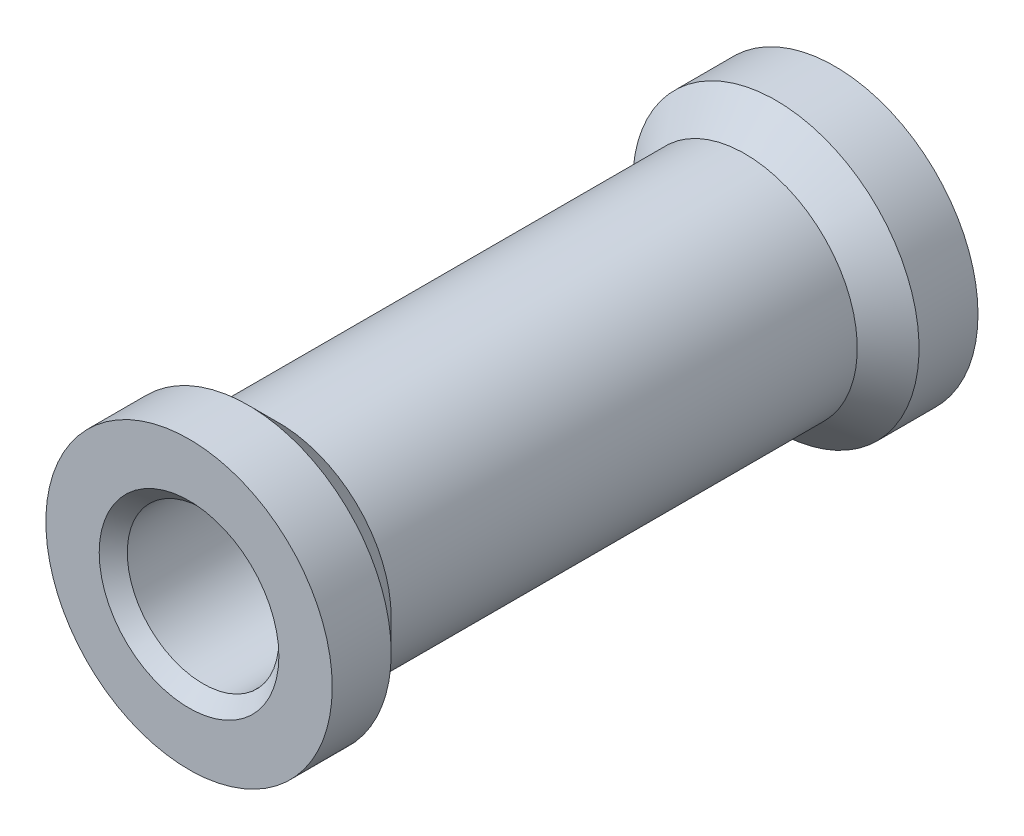
ISO-10303-21;
HEADER;
FILE_DESCRIPTION(('STEP AP214'),'2;1');
FILE_NAME('part.step','',(''),(''),'','','');
FILE_SCHEMA(('AUTOMOTIVE_DESIGN { 1 0 10303 214 1 1 1 1 }'));
ENDSEC;
DATA;
#1=APPLICATION_CONTEXT('core data for automotive mechanical design processes');
#2=APPLICATION_PROTOCOL_DEFINITION('international standard','automotive_design',2000,#1);
#3=PRODUCT_CONTEXT('',#1,'mechanical');
#4=PRODUCT('Part','Part','',(#3));
#5=PRODUCT_RELATED_PRODUCT_CATEGORY('part','',(#4));
#6=PRODUCT_DEFINITION_FORMATION('','',#4);
#7=PRODUCT_DEFINITION_CONTEXT('part definition',#1,'design');
#8=PRODUCT_DEFINITION('design','',#6,#7);
#9=PRODUCT_DEFINITION_SHAPE('','',#8);
#10=(LENGTH_UNIT() NAMED_UNIT(*) SI_UNIT(.MILLI.,.METRE.));
#11=(NAMED_UNIT(*) PLANE_ANGLE_UNIT() SI_UNIT($,.RADIAN.));
#12=(NAMED_UNIT(*) SI_UNIT($,.STERADIAN.) SOLID_ANGLE_UNIT());
#13=UNCERTAINTY_MEASURE_WITH_UNIT(LENGTH_MEASURE(1.E-05),#10,'distance_accuracy_value','');
#14=(GEOMETRIC_REPRESENTATION_CONTEXT(3) GLOBAL_UNCERTAINTY_ASSIGNED_CONTEXT((#13)) GLOBAL_UNIT_ASSIGNED_CONTEXT((#10,
#11,#12)) REPRESENTATION_CONTEXT('',''));
#15=CARTESIAN_POINT('',(0.,0.,0.));
#16=DIRECTION('',(0.,0.,1.));
#17=DIRECTION('',(1.,0.,0.));
#18=AXIS2_PLACEMENT_3D('',#15,#16,#17);
#19=CARTESIAN_POINT('',(0.,0.,0.));
#20=DIRECTION('',(0.,0.,1.));
#21=DIRECTION('',(1.,0.,0.));
#22=AXIS2_PLACEMENT_3D('',#19,#20,#21);
#23=PLANE('',#22);
#24=CARTESIAN_POINT('',(0.,0.,0.));
#25=DIRECTION('',(0.,0.,1.));
#26=DIRECTION('',(1.,0.,0.));
#27=AXIS2_PLACEMENT_3D('',#24,#25,#26);
#28=CIRCLE('',#27,3.19999999999999);
#29=CARTESIAN_POINT('',(3.19999999999999,0.,0.));
#30=VERTEX_POINT('',#29);
#31=EDGE_CURVE('E46',#30,#30,#28,.T.);
#32=ORIENTED_EDGE('',*,*,#31,.T.);
#33=EDGE_LOOP('',(#32));
#34=FACE_BOUND('',#33,.T.);
#35=CARTESIAN_POINT('',(0.,0.,0.));
#36=DIRECTION('',(0.,0.,1.));
#37=DIRECTION('',(1.,0.,0.));
#38=AXIS2_PLACEMENT_3D('',#35,#36,#37);
#39=CIRCLE('',#38,5.1);
#40=CARTESIAN_POINT('',(5.1,0.,0.));
#41=VERTEX_POINT('',#40);
#42=EDGE_CURVE('E63',#41,#41,#39,.T.);
#43=ORIENTED_EDGE('',*,*,#42,.F.);
#44=EDGE_LOOP('',(#43));
#45=FACE_BOUND('',#44,.T.);
#46=ADVANCED_FACE('F31',(#34,#45),#23,.F.);
#47=CARTESIAN_POINT('',(0.,0.,2.));
#48=DIRECTION('',(0.,0.,-1.));
#49=DIRECTION('',(-1.,0.,0.));
#50=AXIS2_PLACEMENT_3D('',#47,#48,#49);
#51=CYLINDRICAL_SURFACE('',#50,5.1);
#52=CARTESIAN_POINT('',(0.,0.,2.10000000000001));
#53=DIRECTION('',(0.,0.,-1.));
#54=DIRECTION('',(-1.,0.,0.));
#55=AXIS2_PLACEMENT_3D('',#52,#53,#54);
#56=CIRCLE('',#55,5.1);
#57=CARTESIAN_POINT('',(-5.1,0.,2.10000000000001));
#58=VERTEX_POINT('',#57);
#59=EDGE_CURVE('E51',#58,#58,#56,.T.);
#60=ORIENTED_EDGE('',*,*,#59,.T.);
#61=EDGE_LOOP('',(#60));
#62=FACE_BOUND('',#61,.T.);
#63=ORIENTED_EDGE('',*,*,#42,.T.);
#64=EDGE_LOOP('',(#63));
#65=FACE_BOUND('',#64,.T.);
#66=ADVANCED_FACE('F88',(#62,#65),#51,.T.);
#67=CARTESIAN_POINT('',(0.,0.,2.));
#68=DIRECTION('',(0.,0.,-1.));
#69=DIRECTION('',(-1.,0.,0.));
#70=AXIS2_PLACEMENT_3D('',#67,#68,#69);
#71=CYLINDRICAL_SURFACE('',#70,2.7);
#72=CARTESIAN_POINT('',(0.,0.,0.499999999999999));
#73=DIRECTION('',(0.,0.,1.));
#74=DIRECTION('',(1.,0.,0.));
#75=AXIS2_PLACEMENT_3D('',#72,#73,#74);
#76=CIRCLE('',#75,2.7);
#77=CARTESIAN_POINT('',(2.7,0.,0.499999999999999));
#78=VERTEX_POINT('',#77);
#79=EDGE_CURVE('E38',#78,#78,#76,.F.);
#80=ORIENTED_EDGE('',*,*,#79,.T.);
#81=EDGE_LOOP('',(#80));
#82=FACE_BOUND('',#81,.T.);
#83=CARTESIAN_POINT('',(0.,0.,22.5));
#84=DIRECTION('',(0.,0.,1.));
#85=DIRECTION('',(1.,0.,0.));
#86=AXIS2_PLACEMENT_3D('',#83,#84,#85);
#87=CIRCLE('',#86,2.7);
#88=CARTESIAN_POINT('',(2.7,0.,22.5));
#89=VERTEX_POINT('',#88);
#90=EDGE_CURVE('E42',#89,#89,#87,.T.);
#91=ORIENTED_EDGE('',*,*,#90,.T.);
#92=EDGE_LOOP('',(#91));
#93=FACE_BOUND('',#92,.T.);
#94=ADVANCED_FACE('F94',(#82,#93),#71,.F.);
#95=CARTESIAN_POINT('',(0.,0.,21.));
#96=DIRECTION('',(0.,0.,-1.));
#97=DIRECTION('',(-1.,0.,0.));
#98=AXIS2_PLACEMENT_3D('',#95,#96,#97);
#99=CYLINDRICAL_SURFACE('',#98,4.);
#100=CARTESIAN_POINT('',(0.,0.,19.8));
#101=DIRECTION('',(0.,0.,1.));
#102=DIRECTION('',(1.,0.,0.));
#103=AXIS2_PLACEMENT_3D('',#100,#101,#102);
#104=CIRCLE('',#103,4.);
#105=CARTESIAN_POINT('',(4.,0.,19.8));
#106=VERTEX_POINT('',#105);
#107=EDGE_CURVE('E57',#106,#106,#104,.F.);
#108=ORIENTED_EDGE('',*,*,#107,.T.);
#109=EDGE_LOOP('',(#108));
#110=FACE_BOUND('',#109,.T.);
#111=CARTESIAN_POINT('',(0.,0.,3.20000000000002));
#112=DIRECTION('',(0.,0.,1.));
#113=DIRECTION('',(1.,0.,0.));
#114=AXIS2_PLACEMENT_3D('',#111,#112,#113);
#115=CIRCLE('',#114,4.);
#116=CARTESIAN_POINT('',(-4.,0.,3.20000000000002));
#117=VERTEX_POINT('',#116);
#118=EDGE_CURVE('E60',#117,#117,#115,.T.);
#119=ORIENTED_EDGE('',*,*,#118,.T.);
#120=EDGE_LOOP('',(#119));
#121=FACE_BOUND('',#120,.T.);
#122=ADVANCED_FACE('F84',(#110,#121),#99,.T.);
#123=CARTESIAN_POINT('',(0.,0.,23.));
#124=DIRECTION('',(0.,0.,1.));
#125=DIRECTION('',(1.,0.,0.));
#126=AXIS2_PLACEMENT_3D('',#123,#124,#125);
#127=PLANE('',#126);
#128=CARTESIAN_POINT('',(0.,0.,23.));
#129=DIRECTION('',(0.,0.,1.));
#130=DIRECTION('',(1.,0.,0.));
#131=AXIS2_PLACEMENT_3D('',#128,#129,#130);
#132=CIRCLE('',#131,3.20000000000002);
#133=CARTESIAN_POINT('',(3.20000000000002,0.,23.));
#134=VERTEX_POINT('',#133);
#135=EDGE_CURVE('E10',#134,#134,#132,.F.);
#136=ORIENTED_EDGE('',*,*,#135,.T.);
#137=EDGE_LOOP('',(#136));
#138=FACE_BOUND('',#137,.T.);
#139=CARTESIAN_POINT('',(0.,0.,23.));
#140=DIRECTION('',(0.,0.,1.));
#141=DIRECTION('',(1.,0.,0.));
#142=AXIS2_PLACEMENT_3D('',#139,#140,#141);
#143=CIRCLE('',#142,5.1);
#144=CARTESIAN_POINT('',(5.1,0.,23.));
#145=VERTEX_POINT('',#144);
#146=EDGE_CURVE('E66',#145,#145,#143,.T.);
#147=ORIENTED_EDGE('',*,*,#146,.T.);
#148=EDGE_LOOP('',(#147));
#149=FACE_BOUND('',#148,.T.);
#150=ADVANCED_FACE('F70',(#138,#149),#127,.T.);
#151=CARTESIAN_POINT('',(0.,0.,23.));
#152=DIRECTION('',(0.,0.,-1.));
#153=DIRECTION('',(-1.,0.,0.));
#154=AXIS2_PLACEMENT_3D('',#151,#152,#153);
#155=CYLINDRICAL_SURFACE('',#154,5.1);
#156=CARTESIAN_POINT('',(0.,0.,20.9));
#157=DIRECTION('',(0.,0.,1.));
#158=DIRECTION('',(1.,0.,0.));
#159=AXIS2_PLACEMENT_3D('',#156,#157,#158);
#160=CIRCLE('',#159,5.1);
#161=CARTESIAN_POINT('',(5.1,0.,20.9));
#162=VERTEX_POINT('',#161);
#163=EDGE_CURVE('E54',#162,#162,#160,.T.);
#164=ORIENTED_EDGE('',*,*,#163,.T.);
#165=EDGE_LOOP('',(#164));
#166=FACE_BOUND('',#165,.T.);
#167=ORIENTED_EDGE('',*,*,#146,.F.);
#168=EDGE_LOOP('',(#167));
#169=FACE_BOUND('',#168,.T.);
#170=ADVANCED_FACE('F72',(#166,#169),#155,.T.);
#171=CARTESIAN_POINT('',(0.,0.,21.));
#172=DIRECTION('',(0.,0.,1.));
#173=DIRECTION('',(1.,0.,0.));
#174=AXIS2_PLACEMENT_3D('',#171,#172,#173);
#175=CONICAL_SURFACE('',#174,5.20000000000002,0.785398163397454);
#176=ORIENTED_EDGE('',*,*,#107,.F.);
#177=EDGE_LOOP('',(#176));
#178=FACE_BOUND('',#177,.T.);
#179=ORIENTED_EDGE('',*,*,#163,.F.);
#180=EDGE_LOOP('',(#179));
#181=FACE_BOUND('',#180,.T.);
#182=ADVANCED_FACE('F74',(#178,#181),#175,.T.);
#183=CARTESIAN_POINT('',(0.,0.,3.20000000000002));
#184=DIRECTION('',(0.,0.,-1.));
#185=DIRECTION('',(-1.,0.,0.));
#186=AXIS2_PLACEMENT_3D('',#183,#184,#185);
#187=CONICAL_SURFACE('',#186,4.,0.785398163397443);
#188=CARTESIAN_POINT('',(-5.1,0.,2.10000000000001));
#189=CARTESIAN_POINT('',(-5.08854166666667,0.,2.11145833333334));
#190=CARTESIAN_POINT('',(-5.07708333333333,0.,2.12291666666668));
#191=CARTESIAN_POINT('',(-5.05416666666667,0.,2.14583333333334));
#192=CARTESIAN_POINT('',(-5.04270833333333,0.,2.15729166666668));
#193=CARTESIAN_POINT('',(-5.01979166666667,0.,2.18020833333334));
#194=CARTESIAN_POINT('',(-5.00833333333333,0.,2.19166666666668));
#195=CARTESIAN_POINT('',(-4.98541666666667,0.,2.21458333333334));
#196=CARTESIAN_POINT('',(-4.97395833333333,0.,2.22604166666668));
#197=CARTESIAN_POINT('',(-4.95104166666667,0.,2.24895833333335));
#198=CARTESIAN_POINT('',(-4.93958333333333,0.,2.26041666666668));
#199=CARTESIAN_POINT('',(-4.91666666666667,0.,2.28333333333335));
#200=CARTESIAN_POINT('',(-4.90520833333333,0.,2.29479166666668));
#201=CARTESIAN_POINT('',(-4.88229166666667,0.,2.31770833333335));
#202=CARTESIAN_POINT('',(-4.87083333333333,0.,2.32916666666668));
#203=CARTESIAN_POINT('',(-4.84791666666667,0.,2.35208333333335));
#204=CARTESIAN_POINT('',(-4.83645833333333,0.,2.36354166666668));
#205=CARTESIAN_POINT('',(-4.81354166666667,0.,2.38645833333335));
#206=CARTESIAN_POINT('',(-4.80208333333333,0.,2.39791666666668));
#207=CARTESIAN_POINT('',(-4.77916666666667,0.,2.42083333333335));
#208=CARTESIAN_POINT('',(-4.76770833333333,0.,2.43229166666668));
#209=CARTESIAN_POINT('',(-4.74479166666667,0.,2.45520833333335));
#210=CARTESIAN_POINT('',(-4.73333333333333,0.,2.46666666666668));
#211=CARTESIAN_POINT('',(-4.71041666666667,0.,2.48958333333335));
#212=CARTESIAN_POINT('',(-4.69895833333333,0.,2.50104166666668));
#213=CARTESIAN_POINT('',(-4.67604166666667,0.,2.52395833333335));
#214=CARTESIAN_POINT('',(-4.66458333333333,0.,2.53541666666668));
#215=CARTESIAN_POINT('',(-4.64166666666667,0.,2.55833333333335));
#216=CARTESIAN_POINT('',(-4.63020833333333,0.,2.56979166666668));
#217=CARTESIAN_POINT('',(-4.60729166666667,0.,2.59270833333335));
#218=CARTESIAN_POINT('',(-4.59583333333333,0.,2.60416666666668));
#219=CARTESIAN_POINT('',(-4.57291666666667,0.,2.62708333333335));
#220=CARTESIAN_POINT('',(-4.56145833333333,0.,2.63854166666668));
#221=CARTESIAN_POINT('',(-4.53854166666667,0.,2.66145833333335));
#222=CARTESIAN_POINT('',(-4.52708333333333,0.,2.67291666666668));
#223=CARTESIAN_POINT('',(-4.50416666666667,0.,2.69583333333335));
#224=CARTESIAN_POINT('',(-4.49270833333333,0.,2.70729166666668));
#225=CARTESIAN_POINT('',(-4.46979166666667,0.,2.73020833333335));
#226=CARTESIAN_POINT('',(-4.45833333333333,0.,2.74166666666668));
#227=CARTESIAN_POINT('',(-4.43541666666667,0.,2.76458333333335));
#228=CARTESIAN_POINT('',(-4.42395833333333,0.,2.77604166666668));
#229=CARTESIAN_POINT('',(-4.40104166666667,0.,2.79895833333335));
#230=CARTESIAN_POINT('',(-4.38958333333333,0.,2.81041666666668));
#231=CARTESIAN_POINT('',(-4.36666666666667,0.,2.83333333333335));
#232=CARTESIAN_POINT('',(-4.35520833333333,0.,2.84479166666669));
#233=CARTESIAN_POINT('',(-4.33229166666667,0.,2.86770833333335));
#234=CARTESIAN_POINT('',(-4.32083333333333,0.,2.87916666666669));
#235=CARTESIAN_POINT('',(-4.29791666666667,0.,2.90208333333335));
#236=CARTESIAN_POINT('',(-4.28645833333333,0.,2.91354166666669));
#237=CARTESIAN_POINT('',(-4.26354166666667,0.,2.93645833333335));
#238=CARTESIAN_POINT('',(-4.25208333333333,0.,2.94791666666669));
#239=CARTESIAN_POINT('',(-4.22916666666667,0.,2.97083333333335));
#240=CARTESIAN_POINT('',(-4.21770833333333,0.,2.98229166666669));
#241=CARTESIAN_POINT('',(-4.19479166666667,0.,3.00520833333335));
#242=CARTESIAN_POINT('',(-4.18333333333333,0.,3.01666666666669));
#243=CARTESIAN_POINT('',(-4.16041666666667,0.,3.03958333333335));
#244=CARTESIAN_POINT('',(-4.14895833333333,0.,3.05104166666669));
#245=CARTESIAN_POINT('',(-4.12604166666667,0.,3.07395833333335));
#246=CARTESIAN_POINT('',(-4.11458333333333,0.,3.08541666666669));
#247=CARTESIAN_POINT('',(-4.09166666666667,0.,3.10833333333335));
#248=CARTESIAN_POINT('',(-4.08020833333333,0.,3.11979166666669));
#249=CARTESIAN_POINT('',(-4.05729166666667,0.,3.14270833333335));
#250=CARTESIAN_POINT('',(-4.04583333333333,0.,3.15416666666669));
#251=CARTESIAN_POINT('',(-4.02291666666667,0.,3.17708333333336));
#252=CARTESIAN_POINT('',(-4.01145833333333,0.,3.18854166666669));
#253=CARTESIAN_POINT('',(-4.,0.,3.20000000000002));
#254=B_SPLINE_CURVE_WITH_KNOTS('',3,(#188,#189,#190,#191,#192,#193,#194,#195,#196,#197,#198,
#199,#200,#201,#202,#203,#204,#205,#206,#207,#208,#209,#210,#211,#212,#213,#214,#215,#216,#217,
#218,#219,#220,#221,#222,#223,#224,#225,#226,#227,#228,#229,#230,#231,#232,#233,#234,#235,#236,
#237,#238,#239,#240,#241,#242,#243,#244,#245,#246,#247,#248,#249,#250,#251,#252,#253),
.UNSPECIFIED.,.F.,.F.,(4,2,2,2,2,2,2,2,2,2,2,2,2,2,2,2,2,2,2,2,2,2,2,2,2,2,2,2,2,2,2,2,4),(0.,
0.0486135912065756,0.0972271824131506,0.145840773619726,0.194454364826302,0.243067956032877,
0.291681547239453,0.340295138446028,0.388908729652603,0.437522320859179,0.486135912065754,
0.53474950327233,0.583363094478905,0.63197668568548,0.680590276892056,0.729203868098631,
0.777817459305207,0.826431050511782,0.875044641718357,0.923658232924933,0.972271824131508,
1.02088541533808,1.06949900654466,1.11811259775123,1.16672618895781,1.21533978016439,
1.26395337137096,1.31256696257754,1.36118055378411,1.40979414499069,1.45840773619726,
1.50702132740384,1.55563491861041),.UNSPECIFIED.);
#255=EDGE_CURVE('BSEAM81',#58,#117,#254,.T.);
#256=ORIENTED_EDGE('',*,*,#59,.F.);
#257=ORIENTED_EDGE('',*,*,#118,.F.);
#258=ORIENTED_EDGE('',*,*,#255,.T.);
#259=ORIENTED_EDGE('',*,*,#255,.F.);
#260=EDGE_LOOP('',(#256,#258,#257,#259));
#261=FACE_BOUND('',#260,.T.);
#262=ADVANCED_FACE('F81',(#261),#187,.T.);
#263=CARTESIAN_POINT('',(0.,0.,0.));
#264=DIRECTION('',(0.,0.,-1.));
#265=DIRECTION('',(-1.,0.,0.));
#266=AXIS2_PLACEMENT_3D('',#263,#264,#265);
#267=CONICAL_SURFACE('',#266,3.19999999999999,0.785398163397444);
#268=ORIENTED_EDGE('',*,*,#79,.F.);
#269=EDGE_LOOP('',(#268));
#270=FACE_BOUND('',#269,.T.);
#271=ORIENTED_EDGE('',*,*,#31,.F.);
#272=EDGE_LOOP('',(#271));
#273=FACE_BOUND('',#272,.T.);
#274=ADVANCED_FACE('F101',(#270,#273),#267,.F.);
#275=CARTESIAN_POINT('',(0.,0.,22.5));
#276=DIRECTION('',(0.,0.,1.));
#277=DIRECTION('',(1.,0.,0.));
#278=AXIS2_PLACEMENT_3D('',#275,#276,#277);
#279=CONICAL_SURFACE('',#278,2.7,0.785398163397449);
#280=ORIENTED_EDGE('',*,*,#135,.F.);
#281=EDGE_LOOP('',(#280));
#282=FACE_BOUND('',#281,.T.);
#283=ORIENTED_EDGE('',*,*,#90,.F.);
#284=EDGE_LOOP('',(#283));
#285=FACE_BOUND('',#284,.T.);
#286=ADVANCED_FACE('F33',(#282,#285),#279,.F.);
#287=CLOSED_SHELL('',(#46,#66,#94,#122,#150,#170,#182,#262,#274,#286));
#288=MANIFOLD_SOLID_BREP('B2',#287);
#289=ADVANCED_BREP_SHAPE_REPRESENTATION('',(#18,#288),#14);
#290=SHAPE_DEFINITION_REPRESENTATION(#9,#289);
ENDSEC;
END-ISO-10303-21;
